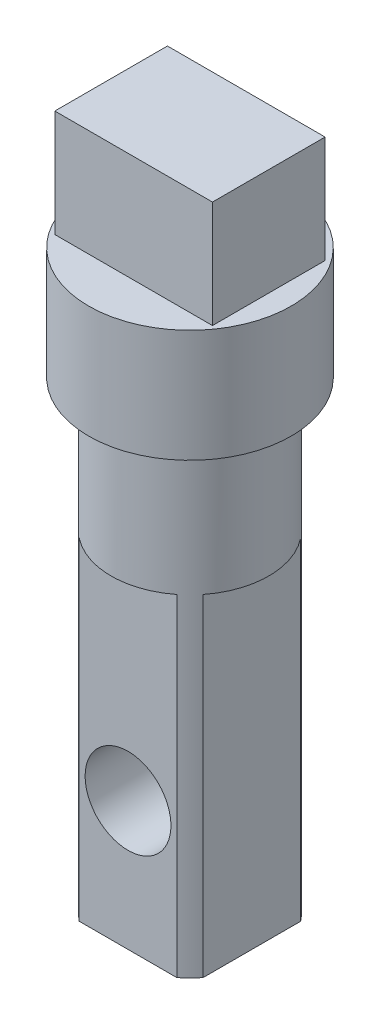
ISO-10303-21;
HEADER;
FILE_DESCRIPTION(('STEP AP214'),'2;1');
FILE_NAME('part.step','',(''),(''),'','','');
FILE_SCHEMA(('AUTOMOTIVE_DESIGN { 1 0 10303 214 1 1 1 1 }'));
ENDSEC;
DATA;
#1=APPLICATION_CONTEXT('core data for automotive mechanical design processes');
#2=APPLICATION_PROTOCOL_DEFINITION('international standard','automotive_design',2000,#1);
#3=PRODUCT_CONTEXT('',#1,'mechanical');
#4=PRODUCT('Part','Part','',(#3));
#5=PRODUCT_RELATED_PRODUCT_CATEGORY('part','',(#4));
#6=PRODUCT_DEFINITION_FORMATION('','',#4);
#7=PRODUCT_DEFINITION_CONTEXT('part definition',#1,'design');
#8=PRODUCT_DEFINITION('design','',#6,#7);
#9=PRODUCT_DEFINITION_SHAPE('','',#8);
#10=(LENGTH_UNIT() NAMED_UNIT(*) SI_UNIT(.MILLI.,.METRE.));
#11=(NAMED_UNIT(*) PLANE_ANGLE_UNIT() SI_UNIT($,.RADIAN.));
#12=(NAMED_UNIT(*) SI_UNIT($,.STERADIAN.) SOLID_ANGLE_UNIT());
#13=UNCERTAINTY_MEASURE_WITH_UNIT(LENGTH_MEASURE(1.E-05),#10,'distance_accuracy_value','');
#14=(GEOMETRIC_REPRESENTATION_CONTEXT(3) GLOBAL_UNCERTAINTY_ASSIGNED_CONTEXT((#13)) GLOBAL_UNIT_ASSIGNED_CONTEXT((#10,
#11,#12)) REPRESENTATION_CONTEXT('',''));
#15=CARTESIAN_POINT('',(0.,0.,0.));
#16=DIRECTION('',(0.,0.,1.));
#17=DIRECTION('',(1.,0.,0.));
#18=AXIS2_PLACEMENT_3D('',#15,#16,#17);
#19=CARTESIAN_POINT('',(0.,51.228,0.));
#20=DIRECTION('',(0.,1.,0.));
#21=DIRECTION('',(0.,0.,1.));
#22=AXIS2_PLACEMENT_3D('',#19,#20,#21);
#23=PLANE('',#22);
#24=CARTESIAN_POINT('',(0.,51.228,0.));
#25=DIRECTION('',(0.,1.,0.));
#26=DIRECTION('',(0.,0.,1.));
#27=AXIS2_PLACEMENT_3D('',#24,#25,#26);
#28=CIRCLE('',#27,9.);
#29=CARTESIAN_POINT('',(0.,51.228,9.));
#30=VERTEX_POINT('',#29);
#31=EDGE_CURVE('E172',#30,#30,#28,.T.);
#32=ORIENTED_EDGE('',*,*,#31,.T.);
#33=EDGE_LOOP('',(#32));
#34=FACE_BOUND('',#33,.T.);
#35=DIRECTION('',(0.,0.,1.));
#36=VECTOR('',#35,1.);
#37=CARTESIAN_POINT('',(-7.,51.228,-5.));
#38=LINE('',#37,#36);
#39=CARTESIAN_POINT('',(-7.,51.228,-5.));
#40=VERTEX_POINT('',#39);
#41=CARTESIAN_POINT('',(-7.,51.228,5.));
#42=VERTEX_POINT('',#41);
#43=EDGE_CURVE('E202',#40,#42,#38,.T.);
#44=ORIENTED_EDGE('',*,*,#43,.F.);
#45=DIRECTION('',(1.,0.,0.));
#46=VECTOR('',#45,1.);
#47=CARTESIAN_POINT('',(-7.,51.228,-5.));
#48=LINE('',#47,#46);
#49=CARTESIAN_POINT('',(7.,51.228,-5.));
#50=VERTEX_POINT('',#49);
#51=EDGE_CURVE('E214',#40,#50,#48,.T.);
#52=ORIENTED_EDGE('',*,*,#51,.T.);
#53=DIRECTION('',(0.,0.,1.));
#54=VECTOR('',#53,1.);
#55=CARTESIAN_POINT('',(7.,51.228,-5.));
#56=LINE('',#55,#54);
#57=CARTESIAN_POINT('',(7.,51.228,5.));
#58=VERTEX_POINT('',#57);
#59=EDGE_CURVE('E211',#50,#58,#56,.T.);
#60=ORIENTED_EDGE('',*,*,#59,.T.);
#61=DIRECTION('',(1.,0.,0.));
#62=VECTOR('',#61,1.);
#63=CARTESIAN_POINT('',(-7.,51.228,5.));
#64=LINE('',#63,#62);
#65=EDGE_CURVE('E207',#42,#58,#64,.T.);
#66=ORIENTED_EDGE('',*,*,#65,.F.);
#67=EDGE_LOOP('',(#44,#52,#60,#66));
#68=FACE_BOUND('',#67,.T.);
#69=ADVANCED_FACE('F45',(#34,#68),#23,.T.);
#70=CARTESIAN_POINT('',(0.,46.228,0.));
#71=DIRECTION('',(0.,-1.,0.));
#72=DIRECTION('',(0.,0.,-1.));
#73=AXIS2_PLACEMENT_3D('',#70,#71,#72);
#74=CYLINDRICAL_SURFACE('',#73,7.);
#75=CARTESIAN_POINT('',(0.,29.464,0.));
#76=DIRECTION('',(0.,1.,0.));
#77=DIRECTION('',(0.,0.,1.));
#78=AXIS2_PLACEMENT_3D('',#75,#76,#77);
#79=CIRCLE('',#78,7.);
#80=CARTESIAN_POINT('',(5.5,29.464,4.33012701892219));
#81=VERTEX_POINT('',#80);
#82=CARTESIAN_POINT('',(5.5,29.464,-4.3301270189222));
#83=VERTEX_POINT('',#82);
#84=EDGE_CURVE('E12',#81,#83,#79,.T.);
#85=ORIENTED_EDGE('',*,*,#84,.T.);
#86=DIRECTION('',(0.,-1.,0.));
#87=VECTOR('',#86,1.);
#88=CARTESIAN_POINT('',(5.5,46.228,-4.33012701892219));
#89=LINE('',#88,#87);
#90=CARTESIAN_POINT('',(5.5,0.,-4.3301270189222));
#91=VERTEX_POINT('',#90);
#92=EDGE_CURVE('E217',#83,#91,#89,.T.);
#93=ORIENTED_EDGE('',*,*,#92,.T.);
#94=CARTESIAN_POINT('',(0.,0.,0.));
#95=DIRECTION('',(0.,1.,0.));
#96=DIRECTION('',(0.,0.,1.));
#97=AXIS2_PLACEMENT_3D('',#94,#95,#96);
#98=CIRCLE('',#97,7.);
#99=CARTESIAN_POINT('',(4.33012701892219,0.,-5.5));
#100=VERTEX_POINT('',#99);
#101=EDGE_CURVE('E161',#91,#100,#98,.T.);
#102=ORIENTED_EDGE('',*,*,#101,.T.);
#103=DIRECTION('',(0.,-1.,0.));
#104=VECTOR('',#103,1.);
#105=CARTESIAN_POINT('',(4.33012701892219,46.228,-5.5));
#106=LINE('',#105,#104);
#107=CARTESIAN_POINT('',(4.3301270189222,29.464,-5.5));
#108=VERTEX_POINT('',#107);
#109=EDGE_CURVE('E240',#100,#108,#106,.F.);
#110=ORIENTED_EDGE('',*,*,#109,.T.);
#111=CARTESIAN_POINT('',(-4.33012701892219,29.464,-5.5));
#112=VERTEX_POINT('',#111);
#113=EDGE_CURVE('E55',#108,#112,#79,.T.);
#114=ORIENTED_EDGE('',*,*,#113,.T.);
#115=DIRECTION('',(0.,-1.,0.));
#116=VECTOR('',#115,1.);
#117=CARTESIAN_POINT('',(-4.33012701892219,46.228,-5.5));
#118=LINE('',#117,#116);
#119=CARTESIAN_POINT('',(-4.33012701892219,0.,-5.5));
#120=VERTEX_POINT('',#119);
#121=EDGE_CURVE('E236',#112,#120,#118,.T.);
#122=ORIENTED_EDGE('',*,*,#121,.T.);
#123=CARTESIAN_POINT('',(-5.5,0.,-4.33012701892219));
#124=VERTEX_POINT('',#123);
#125=EDGE_CURVE('E169',#120,#124,#98,.T.);
#126=ORIENTED_EDGE('',*,*,#125,.T.);
#127=DIRECTION('',(0.,-1.,0.));
#128=VECTOR('',#127,1.);
#129=CARTESIAN_POINT('',(-5.5,46.228,-4.33012701892219));
#130=LINE('',#129,#128);
#131=CARTESIAN_POINT('',(-5.5,29.464,-4.3301270189222));
#132=VERTEX_POINT('',#131);
#133=EDGE_CURVE('E70',#124,#132,#130,.F.);
#134=ORIENTED_EDGE('',*,*,#133,.T.);
#135=CARTESIAN_POINT('',(-5.5,29.464,4.33012701892219));
#136=VERTEX_POINT('',#135);
#137=EDGE_CURVE('E296',#132,#136,#79,.T.);
#138=ORIENTED_EDGE('',*,*,#137,.T.);
#139=DIRECTION('',(0.,-1.,0.));
#140=VECTOR('',#139,1.);
#141=CARTESIAN_POINT('',(-5.5,46.228,4.33012701892219));
#142=LINE('',#141,#140);
#143=CARTESIAN_POINT('',(-5.5,0.,4.33012701892219));
#144=VERTEX_POINT('',#143);
#145=EDGE_CURVE('E244',#136,#144,#142,.T.);
#146=ORIENTED_EDGE('',*,*,#145,.T.);
#147=CARTESIAN_POINT('',(-4.33012701892219,0.,5.5));
#148=VERTEX_POINT('',#147);
#149=EDGE_CURVE('E163',#144,#148,#98,.T.);
#150=ORIENTED_EDGE('',*,*,#149,.T.);
#151=DIRECTION('',(0.,-1.,0.));
#152=VECTOR('',#151,1.);
#153=CARTESIAN_POINT('',(-4.33012701892219,46.228,5.5));
#154=LINE('',#153,#152);
#155=CARTESIAN_POINT('',(-4.33012701892219,29.464,5.5));
#156=VERTEX_POINT('',#155);
#157=EDGE_CURVE('E62',#148,#156,#154,.F.);
#158=ORIENTED_EDGE('',*,*,#157,.T.);
#159=CARTESIAN_POINT('',(4.3301270189222,29.464,5.5));
#160=VERTEX_POINT('',#159);
#161=EDGE_CURVE('E49',#156,#160,#79,.T.);
#162=ORIENTED_EDGE('',*,*,#161,.T.);
#163=DIRECTION('',(0.,-1.,0.));
#164=VECTOR('',#163,1.);
#165=CARTESIAN_POINT('',(4.33012701892219,46.228,5.5));
#166=LINE('',#165,#164);
#167=CARTESIAN_POINT('',(4.3301270189222,0.,5.5));
#168=VERTEX_POINT('',#167);
#169=EDGE_CURVE('E138',#160,#168,#166,.T.);
#170=ORIENTED_EDGE('',*,*,#169,.T.);
#171=CARTESIAN_POINT('',(5.5,0.,4.33012701892219));
#172=VERTEX_POINT('',#171);
#173=EDGE_CURVE('E153',#168,#172,#98,.T.);
#174=ORIENTED_EDGE('',*,*,#173,.T.);
#175=DIRECTION('',(0.,-1.,0.));
#176=VECTOR('',#175,1.);
#177=CARTESIAN_POINT('',(5.5,46.228,4.33012701892219));
#178=LINE('',#177,#176);
#179=EDGE_CURVE('E233',#172,#81,#178,.F.);
#180=ORIENTED_EDGE('',*,*,#179,.T.);
#181=EDGE_LOOP('',(#85,#93,#102,#110,#114,#122,#126,#134,#138,#146,#150,#158,#162,#170,#174,#180));
#182=FACE_BOUND('',#181,.T.);
#183=CARTESIAN_POINT('',(0.,41.228,0.));
#184=DIRECTION('',(0.,1.,0.));
#185=DIRECTION('',(0.,0.,1.));
#186=AXIS2_PLACEMENT_3D('',#183,#184,#185);
#187=CIRCLE('',#186,7.);
#188=CARTESIAN_POINT('',(0.,41.228,7.));
#189=VERTEX_POINT('',#188);
#190=EDGE_CURVE('E146',#189,#189,#187,.T.);
#191=ORIENTED_EDGE('',*,*,#190,.F.);
#192=EDGE_LOOP('',(#191));
#193=FACE_BOUND('',#192,.T.);
#194=ADVANCED_FACE('F47',(#182,#193),#74,.T.);
#195=CARTESIAN_POINT('',(0.,0.,0.));
#196=DIRECTION('',(0.,1.,0.));
#197=DIRECTION('',(0.,0.,1.));
#198=AXIS2_PLACEMENT_3D('',#195,#196,#197);
#199=PLANE('',#198);
#200=ORIENTED_EDGE('',*,*,#101,.F.);
#201=DIRECTION('',(0.,0.,1.));
#202=VECTOR('',#201,1.);
#203=CARTESIAN_POINT('',(5.5,0.,0.));
#204=LINE('',#203,#202);
#205=EDGE_CURVE('E159',#91,#172,#204,.T.);
#206=ORIENTED_EDGE('',*,*,#205,.T.);
#207=ORIENTED_EDGE('',*,*,#173,.F.);
#208=DIRECTION('',(-1.,0.,0.));
#209=VECTOR('',#208,1.);
#210=CARTESIAN_POINT('',(0.,0.,5.5));
#211=LINE('',#210,#209);
#212=EDGE_CURVE('E135',#168,#148,#211,.T.);
#213=ORIENTED_EDGE('',*,*,#212,.T.);
#214=ORIENTED_EDGE('',*,*,#149,.F.);
#215=DIRECTION('',(0.,0.,-1.));
#216=VECTOR('',#215,1.);
#217=CARTESIAN_POINT('',(-5.5,0.,0.));
#218=LINE('',#217,#216);
#219=EDGE_CURVE('E145',#144,#124,#218,.T.);
#220=ORIENTED_EDGE('',*,*,#219,.T.);
#221=ORIENTED_EDGE('',*,*,#125,.F.);
#222=DIRECTION('',(1.,0.,0.));
#223=VECTOR('',#222,1.);
#224=CARTESIAN_POINT('',(0.,0.,-5.5));
#225=LINE('',#224,#223);
#226=EDGE_CURVE('E289',#120,#100,#225,.T.);
#227=ORIENTED_EDGE('',*,*,#226,.T.);
#228=EDGE_LOOP('',(#200,#206,#207,#213,#214,#220,#221,#227));
#229=FACE_BOUND('',#228,.T.);
#230=ADVANCED_FACE('F158',(#229),#199,.F.);
#231=CARTESIAN_POINT('',(0.,51.228,0.));
#232=DIRECTION('',(0.,-1.,0.));
#233=DIRECTION('',(0.,0.,-1.));
#234=AXIS2_PLACEMENT_3D('',#231,#232,#233);
#235=CYLINDRICAL_SURFACE('',#234,9.);
#236=ORIENTED_EDGE('',*,*,#31,.F.);
#237=EDGE_LOOP('',(#236));
#238=FACE_BOUND('',#237,.T.);
#239=CARTESIAN_POINT('',(0.,41.228,0.));
#240=DIRECTION('',(0.,1.,0.));
#241=DIRECTION('',(0.,0.,1.));
#242=AXIS2_PLACEMENT_3D('',#239,#240,#241);
#243=CIRCLE('',#242,9.);
#244=CARTESIAN_POINT('',(0.,41.228,9.));
#245=VERTEX_POINT('',#244);
#246=EDGE_CURVE('E178',#245,#245,#243,.T.);
#247=ORIENTED_EDGE('',*,*,#246,.T.);
#248=EDGE_LOOP('',(#247));
#249=FACE_BOUND('',#248,.T.);
#250=ADVANCED_FACE('F327',(#238,#249),#235,.T.);
#251=CARTESIAN_POINT('',(0.,41.228,0.));
#252=DIRECTION('',(0.,1.,0.));
#253=DIRECTION('',(0.,0.,1.));
#254=AXIS2_PLACEMENT_3D('',#251,#252,#253);
#255=PLANE('',#254);
#256=ORIENTED_EDGE('',*,*,#190,.T.);
#257=EDGE_LOOP('',(#256));
#258=FACE_BOUND('',#257,.T.);
#259=ORIENTED_EDGE('',*,*,#246,.F.);
#260=EDGE_LOOP('',(#259));
#261=FACE_BOUND('',#260,.T.);
#262=ADVANCED_FACE('F325',(#258,#261),#255,.F.);
#263=CARTESIAN_POINT('',(-7.,60.728,-5.));
#264=DIRECTION('',(0.,0.,-1.));
#265=DIRECTION('',(-1.,0.,0.));
#266=AXIS2_PLACEMENT_3D('',#263,#264,#265);
#267=PLANE('',#266);
#268=ORIENTED_EDGE('',*,*,#51,.F.);
#269=DIRECTION('',(0.,-1.,0.));
#270=VECTOR('',#269,1.);
#271=CARTESIAN_POINT('',(-7.,60.728,-5.));
#272=LINE('',#271,#270);
#273=CARTESIAN_POINT('',(-7.,60.728,-5.));
#274=VERTEX_POINT('',#273);
#275=EDGE_CURVE('E184',#274,#40,#272,.T.);
#276=ORIENTED_EDGE('',*,*,#275,.F.);
#277=DIRECTION('',(1.,0.,0.));
#278=VECTOR('',#277,1.);
#279=CARTESIAN_POINT('',(-7.,60.728,-5.));
#280=LINE('',#279,#278);
#281=CARTESIAN_POINT('',(7.,60.728,-5.));
#282=VERTEX_POINT('',#281);
#283=EDGE_CURVE('E206',#274,#282,#280,.T.);
#284=ORIENTED_EDGE('',*,*,#283,.T.);
#285=DIRECTION('',(0.,-1.,0.));
#286=VECTOR('',#285,1.);
#287=CARTESIAN_POINT('',(7.,60.728,-5.));
#288=LINE('',#287,#286);
#289=EDGE_CURVE('E186',#282,#50,#288,.T.);
#290=ORIENTED_EDGE('',*,*,#289,.T.);
#291=EDGE_LOOP('',(#268,#276,#284,#290));
#292=FACE_BOUND('',#291,.T.);
#293=ADVANCED_FACE('F323',(#292),#267,.T.);
#294=CARTESIAN_POINT('',(-7.,60.728,-5.));
#295=DIRECTION('',(1.,0.,0.));
#296=DIRECTION('',(0.,0.,-1.));
#297=AXIS2_PLACEMENT_3D('',#294,#295,#296);
#298=PLANE('',#297);
#299=ORIENTED_EDGE('',*,*,#43,.T.);
#300=DIRECTION('',(0.,-1.,0.));
#301=VECTOR('',#300,1.);
#302=CARTESIAN_POINT('',(-7.,60.728,5.));
#303=LINE('',#302,#301);
#304=CARTESIAN_POINT('',(-7.,60.728,5.));
#305=VERTEX_POINT('',#304);
#306=EDGE_CURVE('E195',#305,#42,#303,.T.);
#307=ORIENTED_EDGE('',*,*,#306,.F.);
#308=DIRECTION('',(0.,0.,1.));
#309=VECTOR('',#308,1.);
#310=CARTESIAN_POINT('',(-7.,60.728,-5.));
#311=LINE('',#310,#309);
#312=EDGE_CURVE('E191',#274,#305,#311,.T.);
#313=ORIENTED_EDGE('',*,*,#312,.F.);
#314=ORIENTED_EDGE('',*,*,#275,.T.);
#315=EDGE_LOOP('',(#299,#307,#313,#314));
#316=FACE_BOUND('',#315,.T.);
#317=ADVANCED_FACE('F415',(#316),#298,.F.);
#318=CARTESIAN_POINT('',(-7.,60.728,5.));
#319=DIRECTION('',(0.,0.,-1.));
#320=DIRECTION('',(-1.,0.,0.));
#321=AXIS2_PLACEMENT_3D('',#318,#319,#320);
#322=PLANE('',#321);
#323=ORIENTED_EDGE('',*,*,#65,.T.);
#324=DIRECTION('',(0.,-1.,0.));
#325=VECTOR('',#324,1.);
#326=CARTESIAN_POINT('',(7.,60.728,5.));
#327=LINE('',#326,#325);
#328=CARTESIAN_POINT('',(7.,60.728,5.));
#329=VERTEX_POINT('',#328);
#330=EDGE_CURVE('E190',#329,#58,#327,.T.);
#331=ORIENTED_EDGE('',*,*,#330,.F.);
#332=DIRECTION('',(1.,0.,0.));
#333=VECTOR('',#332,1.);
#334=CARTESIAN_POINT('',(-7.,60.728,5.));
#335=LINE('',#334,#333);
#336=EDGE_CURVE('E220',#305,#329,#335,.T.);
#337=ORIENTED_EDGE('',*,*,#336,.F.);
#338=ORIENTED_EDGE('',*,*,#306,.T.);
#339=EDGE_LOOP('',(#323,#331,#337,#338));
#340=FACE_BOUND('',#339,.T.);
#341=ADVANCED_FACE('F411',(#340),#322,.F.);
#342=CARTESIAN_POINT('',(7.,60.728,-5.));
#343=DIRECTION('',(1.,0.,0.));
#344=DIRECTION('',(0.,0.,-1.));
#345=AXIS2_PLACEMENT_3D('',#342,#343,#344);
#346=PLANE('',#345);
#347=ORIENTED_EDGE('',*,*,#59,.F.);
#348=ORIENTED_EDGE('',*,*,#289,.F.);
#349=DIRECTION('',(0.,0.,1.));
#350=VECTOR('',#349,1.);
#351=CARTESIAN_POINT('',(7.,60.728,-5.));
#352=LINE('',#351,#350);
#353=EDGE_CURVE('E223',#282,#329,#352,.T.);
#354=ORIENTED_EDGE('',*,*,#353,.T.);
#355=ORIENTED_EDGE('',*,*,#330,.T.);
#356=EDGE_LOOP('',(#347,#348,#354,#355));
#357=FACE_BOUND('',#356,.T.);
#358=ADVANCED_FACE('F405',(#357),#346,.T.);
#359=CARTESIAN_POINT('',(0.,60.728,0.));
#360=DIRECTION('',(0.,-1.,0.));
#361=DIRECTION('',(0.,0.,-1.));
#362=AXIS2_PLACEMENT_3D('',#359,#360,#361);
#363=PLANE('',#362);
#364=ORIENTED_EDGE('',*,*,#283,.F.);
#365=ORIENTED_EDGE('',*,*,#312,.T.);
#366=ORIENTED_EDGE('',*,*,#336,.T.);
#367=ORIENTED_EDGE('',*,*,#353,.F.);
#368=EDGE_LOOP('',(#364,#365,#366,#367));
#369=FACE_BOUND('',#368,.T.);
#370=ADVANCED_FACE('F402',(#369),#363,.F.);
#371=CARTESIAN_POINT('',(-5.5,29.464,5.5));
#372=DIRECTION('',(0.,0.,-1.));
#373=DIRECTION('',(-1.,0.,0.));
#374=AXIS2_PLACEMENT_3D('',#371,#372,#373);
#375=PLANE('',#374);
#376=CARTESIAN_POINT('',(0.,11.43,5.5));
#377=DIRECTION('',(0.,0.,-1.));
#378=DIRECTION('',(-1.,0.,0.));
#379=AXIS2_PLACEMENT_3D('',#376,#377,#378);
#380=CIRCLE('',#379,3.81);
#381=CARTESIAN_POINT('',(-3.81,11.43,5.5));
#382=VERTEX_POINT('',#381);
#383=EDGE_CURVE('E266',#382,#382,#380,.T.);
#384=ORIENTED_EDGE('',*,*,#383,.T.);
#385=EDGE_LOOP('',(#384));
#386=FACE_BOUND('',#385,.T.);
#387=DIRECTION('',(1.,0.,0.));
#388=VECTOR('',#387,1.);
#389=CARTESIAN_POINT('',(-5.5,29.464,5.5));
#390=LINE('',#389,#388);
#391=EDGE_CURVE('E251',#156,#160,#390,.T.);
#392=ORIENTED_EDGE('',*,*,#391,.F.);
#393=ORIENTED_EDGE('',*,*,#157,.F.);
#394=ORIENTED_EDGE('',*,*,#212,.F.);
#395=ORIENTED_EDGE('',*,*,#169,.F.);
#396=EDGE_LOOP('',(#392,#393,#394,#395));
#397=FACE_BOUND('',#396,.T.);
#398=ADVANCED_FACE('F137',(#386,#397),#375,.F.);
#399=CARTESIAN_POINT('',(0.,29.464,0.));
#400=DIRECTION('',(0.,1.,0.));
#401=DIRECTION('',(0.,0.,1.));
#402=AXIS2_PLACEMENT_3D('',#399,#400,#401);
#403=PLANE('',#402);
#404=ORIENTED_EDGE('',*,*,#391,.T.);
#405=ORIENTED_EDGE('',*,*,#161,.F.);
#406=EDGE_LOOP('',(#404,#405));
#407=FACE_BOUND('',#406,.T.);
#408=ADVANCED_FACE('F303',(#407),#403,.F.);
#409=CARTESIAN_POINT('',(-5.5,29.464,5.5));
#410=DIRECTION('',(1.,0.,0.));
#411=DIRECTION('',(0.,0.,-1.));
#412=AXIS2_PLACEMENT_3D('',#409,#410,#411);
#413=PLANE('',#412);
#414=DIRECTION('',(0.,0.,1.));
#415=VECTOR('',#414,1.);
#416=CARTESIAN_POINT('',(-5.5,29.464,5.5));
#417=LINE('',#416,#415);
#418=EDGE_CURVE('E254',#132,#136,#417,.T.);
#419=ORIENTED_EDGE('',*,*,#418,.F.);
#420=ORIENTED_EDGE('',*,*,#133,.F.);
#421=ORIENTED_EDGE('',*,*,#219,.F.);
#422=ORIENTED_EDGE('',*,*,#145,.F.);
#423=EDGE_LOOP('',(#419,#420,#421,#422));
#424=FACE_BOUND('',#423,.T.);
#425=ADVANCED_FACE('F301',(#424),#413,.F.);
#426=ORIENTED_EDGE('',*,*,#418,.T.);
#427=ORIENTED_EDGE('',*,*,#137,.F.);
#428=EDGE_LOOP('',(#426,#427));
#429=FACE_BOUND('',#428,.T.);
#430=ADVANCED_FACE('F282',(#429),#403,.F.);
#431=CARTESIAN_POINT('',(-5.5,29.464,-5.5));
#432=DIRECTION('',(0.,0.,1.));
#433=DIRECTION('',(1.,0.,0.));
#434=AXIS2_PLACEMENT_3D('',#431,#432,#433);
#435=PLANE('',#434);
#436=CARTESIAN_POINT('',(0.,11.43,-5.5));
#437=DIRECTION('',(0.,0.,-1.));
#438=DIRECTION('',(-1.,0.,0.));
#439=AXIS2_PLACEMENT_3D('',#436,#437,#438);
#440=CIRCLE('',#439,3.81);
#441=CARTESIAN_POINT('',(-3.81,11.43,-5.5));
#442=VERTEX_POINT('',#441);
#443=EDGE_CURVE('E270',#442,#442,#440,.T.);
#444=ORIENTED_EDGE('',*,*,#443,.F.);
#445=EDGE_LOOP('',(#444));
#446=FACE_BOUND('',#445,.T.);
#447=DIRECTION('',(-1.,0.,0.));
#448=VECTOR('',#447,1.);
#449=CARTESIAN_POINT('',(-5.5,29.464,-5.5));
#450=LINE('',#449,#448);
#451=EDGE_CURVE('E258',#108,#112,#450,.T.);
#452=ORIENTED_EDGE('',*,*,#451,.F.);
#453=ORIENTED_EDGE('',*,*,#109,.F.);
#454=ORIENTED_EDGE('',*,*,#226,.F.);
#455=ORIENTED_EDGE('',*,*,#121,.F.);
#456=EDGE_LOOP('',(#452,#453,#454,#455));
#457=FACE_BOUND('',#456,.T.);
#458=ADVANCED_FACE('F278',(#446,#457),#435,.F.);
#459=ORIENTED_EDGE('',*,*,#451,.T.);
#460=ORIENTED_EDGE('',*,*,#113,.F.);
#461=EDGE_LOOP('',(#459,#460));
#462=FACE_BOUND('',#461,.T.);
#463=ADVANCED_FACE('F281',(#462),#403,.F.);
#464=DIRECTION('',(0.,0.,-1.));
#465=VECTOR('',#464,1.);
#466=CARTESIAN_POINT('',(5.5,29.464,5.5));
#467=LINE('',#466,#465);
#468=EDGE_CURVE('E262',#81,#83,#467,.T.);
#469=ORIENTED_EDGE('',*,*,#468,.T.);
#470=ORIENTED_EDGE('',*,*,#84,.F.);
#471=EDGE_LOOP('',(#469,#470));
#472=FACE_BOUND('',#471,.T.);
#473=ADVANCED_FACE('F311',(#472),#403,.F.);
#474=CARTESIAN_POINT('',(5.5,29.464,5.5));
#475=DIRECTION('',(-1.,0.,0.));
#476=DIRECTION('',(0.,0.,1.));
#477=AXIS2_PLACEMENT_3D('',#474,#475,#476);
#478=PLANE('',#477);
#479=ORIENTED_EDGE('',*,*,#468,.F.);
#480=ORIENTED_EDGE('',*,*,#179,.F.);
#481=ORIENTED_EDGE('',*,*,#205,.F.);
#482=ORIENTED_EDGE('',*,*,#92,.F.);
#483=EDGE_LOOP('',(#479,#480,#481,#482));
#484=FACE_BOUND('',#483,.T.);
#485=ADVANCED_FACE('F383',(#484),#478,.F.);
#486=CARTESIAN_POINT('',(0.,11.43,9.));
#487=DIRECTION('',(0.,0.,-1.));
#488=DIRECTION('',(-1.,0.,0.));
#489=AXIS2_PLACEMENT_3D('',#486,#487,#488);
#490=CYLINDRICAL_SURFACE('',#489,3.81);
#491=ORIENTED_EDGE('',*,*,#443,.T.);
#492=EDGE_LOOP('',(#491));
#493=FACE_BOUND('',#492,.T.);
#494=ORIENTED_EDGE('',*,*,#383,.F.);
#495=EDGE_LOOP('',(#494));
#496=FACE_BOUND('',#495,.T.);
#497=ADVANCED_FACE('F275',(#493,#496),#490,.F.);
#498=CLOSED_SHELL('',(#69,#194,#230,#250,#262,#293,#317,#341,#358,#370,#398,#408,#425,#430,#458,
#463,#473,#485,#497));
#499=MANIFOLD_SOLID_BREP('B2',#498);
#500=ADVANCED_BREP_SHAPE_REPRESENTATION('',(#18,#499),#14);
#501=SHAPE_DEFINITION_REPRESENTATION(#9,#500);
ENDSEC;
END-ISO-10303-21;
